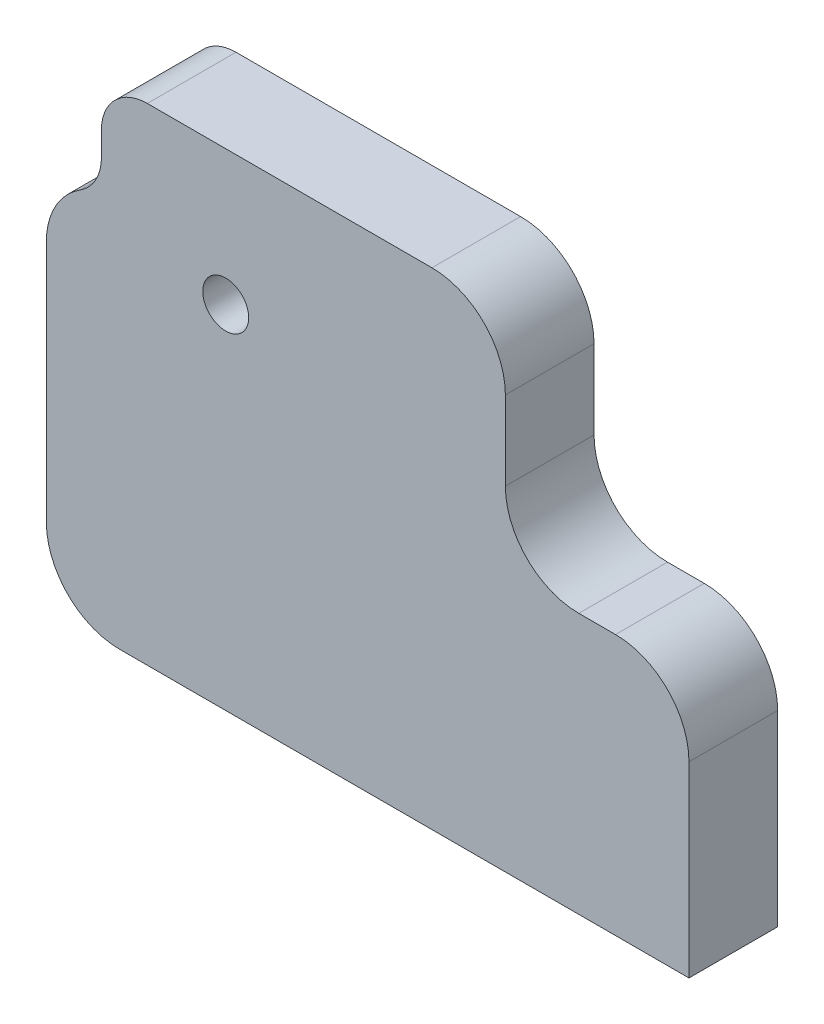
ISO-10303-21;
HEADER;
FILE_DESCRIPTION(('STEP AP214'),'2;1');
FILE_NAME('part.step','',(''),(''),'','','');
FILE_SCHEMA(('AUTOMOTIVE_DESIGN { 1 0 10303 214 1 1 1 1 }'));
ENDSEC;
DATA;
#1=APPLICATION_CONTEXT('core data for automotive mechanical design processes');
#2=APPLICATION_PROTOCOL_DEFINITION('international standard','automotive_design',2000,#1);
#3=PRODUCT_CONTEXT('',#1,'mechanical');
#4=PRODUCT('Part','Part','',(#3));
#5=PRODUCT_RELATED_PRODUCT_CATEGORY('part','',(#4));
#6=PRODUCT_DEFINITION_FORMATION('','',#4);
#7=PRODUCT_DEFINITION_CONTEXT('part definition',#1,'design');
#8=PRODUCT_DEFINITION('design','',#6,#7);
#9=PRODUCT_DEFINITION_SHAPE('','',#8);
#10=(LENGTH_UNIT() NAMED_UNIT(*) SI_UNIT(.MILLI.,.METRE.));
#11=(NAMED_UNIT(*) PLANE_ANGLE_UNIT() SI_UNIT($,.RADIAN.));
#12=(NAMED_UNIT(*) SI_UNIT($,.STERADIAN.) SOLID_ANGLE_UNIT());
#13=UNCERTAINTY_MEASURE_WITH_UNIT(LENGTH_MEASURE(1.E-05),#10,'distance_accuracy_value','');
#14=(GEOMETRIC_REPRESENTATION_CONTEXT(3) GLOBAL_UNCERTAINTY_ASSIGNED_CONTEXT((#13)) GLOBAL_UNIT_ASSIGNED_CONTEXT((#10,
#11,#12)) REPRESENTATION_CONTEXT('',''));
#15=CARTESIAN_POINT('',(0.,0.,0.));
#16=DIRECTION('',(0.,0.,1.));
#17=DIRECTION('',(1.,0.,0.));
#18=AXIS2_PLACEMENT_3D('',#15,#16,#17);
#19=CARTESIAN_POINT('',(19.,5.,2.415));
#20=DIRECTION('',(0.,-1.,0.));
#21=DIRECTION('',(0.,0.,-1.));
#22=AXIS2_PLACEMENT_3D('',#19,#20,#21);
#23=CONICAL_SURFACE('',#22,1.25,1.02974425867665);
#24=CARTESIAN_POINT('',(19.,5.75107577378445,2.415));
#25=VERTEX_POINT('',#24);
#26=VERTEX_LOOP('',#25);
#27=FACE_BOUND('',#26,.T.);
#28=CARTESIAN_POINT('',(19.,5.,2.415));
#29=DIRECTION('',(0.,-1.,0.));
#30=DIRECTION('',(0.,0.,-1.));
#31=AXIS2_PLACEMENT_3D('',#28,#29,#30);
#32=CIRCLE('',#31,1.25);
#33=CARTESIAN_POINT('',(19.,5.,1.165));
#34=VERTEX_POINT('',#33);
#35=EDGE_CURVE('E186',#34,#34,#32,.T.);
#36=ORIENTED_EDGE('',*,*,#35,.T.);
#37=EDGE_LOOP('',(#36));
#38=FACE_BOUND('',#37,.T.);
#39=ADVANCED_FACE('F49',(#27,#38),#23,.F.);
#40=CARTESIAN_POINT('',(19.,0.,2.415));
#41=DIRECTION('',(0.,-1.,0.));
#42=DIRECTION('',(0.,0.,-1.));
#43=AXIS2_PLACEMENT_3D('',#40,#41,#42);
#44=CYLINDRICAL_SURFACE('',#43,1.24999999999999);
#45=ORIENTED_EDGE('',*,*,#35,.F.);
#46=EDGE_LOOP('',(#45));
#47=FACE_BOUND('',#46,.T.);
#48=CARTESIAN_POINT('',(19.,-4.5,2.415));
#49=DIRECTION('',(0.,-1.,0.));
#50=DIRECTION('',(1.,0.,0.));
#51=AXIS2_PLACEMENT_3D('',#48,#49,#50);
#52=CIRCLE('',#51,1.24999999999999);
#53=CARTESIAN_POINT('',(20.25,-4.5,2.415));
#54=VERTEX_POINT('',#53);
#55=EDGE_CURVE('E646',#54,#54,#52,.T.);
#56=ORIENTED_EDGE('',*,*,#55,.T.);
#57=EDGE_LOOP('',(#56));
#58=FACE_BOUND('',#57,.T.);
#59=ADVANCED_FACE('F353',(#47,#58),#44,.F.);
#60=CARTESIAN_POINT('',(0.,-4.5,0.));
#61=DIRECTION('',(0.,1.,0.));
#62=DIRECTION('',(-1.,0.,0.));
#63=AXIS2_PLACEMENT_3D('',#60,#61,#62);
#64=PLANE('',#63);
#65=DIRECTION('',(-1.,0.,0.));
#66=VECTOR('',#65,1.);
#67=CARTESIAN_POINT('',(0.,-4.5,4.83));
#68=LINE('',#67,#66);
#69=CARTESIAN_POINT('',(35.,-4.5,4.83));
#70=VERTEX_POINT('',#69);
#71=CARTESIAN_POINT('',(4.,-4.5,4.83));
#72=VERTEX_POINT('',#71);
#73=EDGE_CURVE('E183',#70,#72,#68,.T.);
#74=ORIENTED_EDGE('',*,*,#73,.T.);
#75=DIRECTION('',(0.,0.,-1.));
#76=VECTOR('',#75,1.);
#77=CARTESIAN_POINT('',(4.,-4.5,0.));
#78=LINE('',#77,#76);
#79=CARTESIAN_POINT('',(4.,-4.5,0.));
#80=VERTEX_POINT('',#79);
#81=EDGE_CURVE('E164',#72,#80,#78,.T.);
#82=ORIENTED_EDGE('',*,*,#81,.T.);
#83=DIRECTION('',(1.,0.,0.));
#84=VECTOR('',#83,1.);
#85=CARTESIAN_POINT('',(0.,-4.5,0.));
#86=LINE('',#85,#84);
#87=CARTESIAN_POINT('',(35.,-4.5,0.));
#88=VERTEX_POINT('',#87);
#89=EDGE_CURVE('E155',#80,#88,#86,.T.);
#90=ORIENTED_EDGE('',*,*,#89,.T.);
#91=DIRECTION('',(0.,0.,1.));
#92=VECTOR('',#91,1.);
#93=CARTESIAN_POINT('',(35.,-4.5,0.));
#94=LINE('',#93,#92);
#95=EDGE_CURVE('E161',#88,#70,#94,.T.);
#96=ORIENTED_EDGE('',*,*,#95,.T.);
#97=EDGE_LOOP('',(#74,#82,#90,#96));
#98=FACE_BOUND('',#97,.T.);
#99=CARTESIAN_POINT('',(31.,-4.5,2.415));
#100=DIRECTION('',(0.,-1.,0.));
#101=DIRECTION('',(1.,0.,0.));
#102=AXIS2_PLACEMENT_3D('',#99,#100,#101);
#103=CIRCLE('',#102,1.25);
#104=CARTESIAN_POINT('',(32.25,-4.5,2.415));
#105=VERTEX_POINT('',#104);
#106=EDGE_CURVE('E166',#105,#105,#103,.T.);
#107=ORIENTED_EDGE('',*,*,#106,.F.);
#108=EDGE_LOOP('',(#107));
#109=FACE_BOUND('',#108,.T.);
#110=ORIENTED_EDGE('',*,*,#55,.F.);
#111=EDGE_LOOP('',(#110));
#112=FACE_BOUND('',#111,.T.);
#113=ADVANCED_FACE('F158',(#98,#109,#112),#64,.F.);
#114=CARTESIAN_POINT('',(0.499999999999999,18.2,4.83));
#115=DIRECTION('',(0.,0.,1.));
#116=DIRECTION('',(1.,0.,0.));
#117=AXIS2_PLACEMENT_3D('',#114,#115,#116);
#118=CYLINDRICAL_SURFACE('',#117,2.5);
#119=CARTESIAN_POINT('',(0.499999999999999,18.2,0.));
#120=DIRECTION('',(0.,0.,1.));
#121=DIRECTION('',(1.,0.,0.));
#122=AXIS2_PLACEMENT_3D('',#119,#120,#121);
#123=CIRCLE('',#122,2.5);
#124=CARTESIAN_POINT('',(1.84615384615385,16.0933747788263,0.));
#125=VERTEX_POINT('',#124);
#126=CARTESIAN_POINT('',(3.,18.2,0.));
#127=VERTEX_POINT('',#126);
#128=EDGE_CURVE('E258',#125,#127,#123,.T.);
#129=ORIENTED_EDGE('',*,*,#128,.F.);
#130=DIRECTION('',(0.,0.,1.));
#131=VECTOR('',#130,1.);
#132=CARTESIAN_POINT('',(1.84615384615385,16.0933747788263,4.83));
#133=LINE('',#132,#131);
#134=CARTESIAN_POINT('',(1.84615384615385,16.0933747788263,4.83));
#135=VERTEX_POINT('',#134);
#136=EDGE_CURVE('E308',#125,#135,#133,.T.);
#137=ORIENTED_EDGE('',*,*,#136,.T.);
#138=CARTESIAN_POINT('',(0.499999999999999,18.2,4.83));
#139=DIRECTION('',(0.,0.,1.));
#140=DIRECTION('',(1.,0.,0.));
#141=AXIS2_PLACEMENT_3D('',#138,#139,#140);
#142=CIRCLE('',#141,2.5);
#143=CARTESIAN_POINT('',(3.,18.2,4.83));
#144=VERTEX_POINT('',#143);
#145=EDGE_CURVE('E261',#144,#135,#142,.F.);
#146=ORIENTED_EDGE('',*,*,#145,.F.);
#147=DIRECTION('',(0.,0.,-1.));
#148=VECTOR('',#147,1.);
#149=CARTESIAN_POINT('',(3.,18.2,4.83));
#150=LINE('',#149,#148);
#151=EDGE_CURVE('E228',#127,#144,#150,.F.);
#152=ORIENTED_EDGE('',*,*,#151,.F.);
#153=EDGE_LOOP('',(#129,#137,#146,#152));
#154=FACE_BOUND('',#153,.T.);
#155=ADVANCED_FACE('F396',(#154),#118,.F.);
#156=CARTESIAN_POINT('',(3.,0.,4.83));
#157=DIRECTION('',(-1.,0.,0.));
#158=DIRECTION('',(0.,0.,1.));
#159=AXIS2_PLACEMENT_3D('',#156,#157,#158);
#160=PLANE('',#159);
#161=DIRECTION('',(0.,1.,0.));
#162=VECTOR('',#161,1.);
#163=CARTESIAN_POINT('',(3.,0.,4.83));
#164=LINE('',#163,#162);
#165=CARTESIAN_POINT('',(3.,19.5,4.83));
#166=VERTEX_POINT('',#165);
#167=EDGE_CURVE('E206',#144,#166,#164,.T.);
#168=ORIENTED_EDGE('',*,*,#167,.T.);
#169=DIRECTION('',(0.,0.,-1.));
#170=VECTOR('',#169,1.);
#171=CARTESIAN_POINT('',(3.,19.5,4.83));
#172=LINE('',#171,#170);
#173=CARTESIAN_POINT('',(3.,19.5,0.));
#174=VERTEX_POINT('',#173);
#175=EDGE_CURVE('E245',#166,#174,#172,.T.);
#176=ORIENTED_EDGE('',*,*,#175,.T.);
#177=DIRECTION('',(0.,1.,0.));
#178=VECTOR('',#177,1.);
#179=CARTESIAN_POINT('',(3.,0.,0.));
#180=LINE('',#179,#178);
#181=EDGE_CURVE('E205',#127,#174,#180,.T.);
#182=ORIENTED_EDGE('',*,*,#181,.F.);
#183=ORIENTED_EDGE('',*,*,#151,.T.);
#184=EDGE_LOOP('',(#168,#176,#182,#183));
#185=FACE_BOUND('',#184,.T.);
#186=ADVANCED_FACE('F393',(#185),#160,.T.);
#187=CARTESIAN_POINT('',(5.5,19.5,4.83));
#188=DIRECTION('',(0.,0.,-1.));
#189=DIRECTION('',(-1.,0.,0.));
#190=AXIS2_PLACEMENT_3D('',#187,#188,#189);
#191=CYLINDRICAL_SURFACE('',#190,2.5);
#192=CARTESIAN_POINT('',(5.5,19.5,4.83));
#193=DIRECTION('',(0.,0.,1.));
#194=DIRECTION('',(1.,0.,0.));
#195=AXIS2_PLACEMENT_3D('',#192,#193,#194);
#196=CIRCLE('',#195,2.5);
#197=CARTESIAN_POINT('',(5.5,22.,4.83));
#198=VERTEX_POINT('',#197);
#199=EDGE_CURVE('E255',#198,#166,#196,.T.);
#200=ORIENTED_EDGE('',*,*,#199,.F.);
#201=DIRECTION('',(0.,0.,-1.));
#202=VECTOR('',#201,1.);
#203=CARTESIAN_POINT('',(5.5,22.,4.83));
#204=LINE('',#203,#202);
#205=CARTESIAN_POINT('',(5.5,22.,0.));
#206=VERTEX_POINT('',#205);
#207=EDGE_CURVE('E252',#206,#198,#204,.F.);
#208=ORIENTED_EDGE('',*,*,#207,.F.);
#209=CARTESIAN_POINT('',(5.5,19.5,0.));
#210=DIRECTION('',(0.,0.,1.));
#211=DIRECTION('',(1.,0.,0.));
#212=AXIS2_PLACEMENT_3D('',#209,#210,#211);
#213=CIRCLE('',#212,2.5);
#214=EDGE_CURVE('E249',#174,#206,#213,.F.);
#215=ORIENTED_EDGE('',*,*,#214,.F.);
#216=ORIENTED_EDGE('',*,*,#175,.F.);
#217=EDGE_LOOP('',(#200,#208,#215,#216));
#218=FACE_BOUND('',#217,.T.);
#219=ADVANCED_FACE('F383',(#218),#191,.T.);
#220=CARTESIAN_POINT('',(0.,22.,4.83));
#221=DIRECTION('',(0.,1.,0.));
#222=DIRECTION('',(-1.,0.,0.));
#223=AXIS2_PLACEMENT_3D('',#220,#221,#222);
#224=PLANE('',#223);
#225=DIRECTION('',(1.,0.,0.));
#226=VECTOR('',#225,1.);
#227=CARTESIAN_POINT('',(0.,22.,4.83));
#228=LINE('',#227,#226);
#229=CARTESIAN_POINT('',(21.,22.,4.83));
#230=VERTEX_POINT('',#229);
#231=EDGE_CURVE('E224',#198,#230,#228,.T.);
#232=ORIENTED_EDGE('',*,*,#231,.T.);
#233=DIRECTION('',(0.,0.,-1.));
#234=VECTOR('',#233,1.);
#235=CARTESIAN_POINT('',(21.,22.,4.83));
#236=LINE('',#235,#234);
#237=CARTESIAN_POINT('',(21.,22.,0.));
#238=VERTEX_POINT('',#237);
#239=EDGE_CURVE('E300',#230,#238,#236,.T.);
#240=ORIENTED_EDGE('',*,*,#239,.T.);
#241=DIRECTION('',(1.,0.,0.));
#242=VECTOR('',#241,1.);
#243=CARTESIAN_POINT('',(0.,22.,0.));
#244=LINE('',#243,#242);
#245=EDGE_CURVE('E211',#206,#238,#244,.T.);
#246=ORIENTED_EDGE('',*,*,#245,.F.);
#247=ORIENTED_EDGE('',*,*,#207,.T.);
#248=EDGE_LOOP('',(#232,#240,#246,#247));
#249=FACE_BOUND('',#248,.T.);
#250=ADVANCED_FACE('F379',(#249),#224,.T.);
#251=CARTESIAN_POINT('',(21.,18.,4.83));
#252=DIRECTION('',(0.,0.,-1.));
#253=DIRECTION('',(-1.,0.,0.));
#254=AXIS2_PLACEMENT_3D('',#251,#252,#253);
#255=CYLINDRICAL_SURFACE('',#254,4.);
#256=CARTESIAN_POINT('',(21.,18.,4.83));
#257=DIRECTION('',(0.,0.,1.));
#258=DIRECTION('',(1.,0.,0.));
#259=AXIS2_PLACEMENT_3D('',#256,#257,#258);
#260=CIRCLE('',#259,4.);
#261=CARTESIAN_POINT('',(25.,18.,4.83));
#262=VERTEX_POINT('',#261);
#263=EDGE_CURVE('E287',#262,#230,#260,.T.);
#264=ORIENTED_EDGE('',*,*,#263,.F.);
#265=DIRECTION('',(0.,0.,-1.));
#266=VECTOR('',#265,1.);
#267=CARTESIAN_POINT('',(25.,18.,4.83));
#268=LINE('',#267,#266);
#269=CARTESIAN_POINT('',(25.,18.,0.));
#270=VERTEX_POINT('',#269);
#271=EDGE_CURVE('E293',#270,#262,#268,.F.);
#272=ORIENTED_EDGE('',*,*,#271,.F.);
#273=CARTESIAN_POINT('',(21.,18.,0.));
#274=DIRECTION('',(0.,0.,1.));
#275=DIRECTION('',(1.,0.,0.));
#276=AXIS2_PLACEMENT_3D('',#273,#274,#275);
#277=CIRCLE('',#276,4.);
#278=EDGE_CURVE('E275',#238,#270,#277,.F.);
#279=ORIENTED_EDGE('',*,*,#278,.F.);
#280=ORIENTED_EDGE('',*,*,#239,.F.);
#281=EDGE_LOOP('',(#264,#272,#279,#280));
#282=FACE_BOUND('',#281,.T.);
#283=ADVANCED_FACE('F382',(#282),#255,.T.);
#284=CARTESIAN_POINT('',(25.,0.,4.83));
#285=DIRECTION('',(1.,0.,0.));
#286=DIRECTION('',(0.,1.,0.));
#287=AXIS2_PLACEMENT_3D('',#284,#285,#286);
#288=PLANE('',#287);
#289=DIRECTION('',(0.,-1.,0.));
#290=VECTOR('',#289,1.);
#291=CARTESIAN_POINT('',(25.,0.,4.83));
#292=LINE('',#291,#290);
#293=CARTESIAN_POINT('',(25.,13.7,4.83));
#294=VERTEX_POINT('',#293);
#295=EDGE_CURVE('E220',#262,#294,#292,.T.);
#296=ORIENTED_EDGE('',*,*,#295,.T.);
#297=DIRECTION('',(0.,0.,-1.));
#298=VECTOR('',#297,1.);
#299=CARTESIAN_POINT('',(25.,13.7,0.));
#300=LINE('',#299,#298);
#301=CARTESIAN_POINT('',(25.,13.7,0.));
#302=VERTEX_POINT('',#301);
#303=EDGE_CURVE('E296',#294,#302,#300,.T.);
#304=ORIENTED_EDGE('',*,*,#303,.T.);
#305=DIRECTION('',(0.,-1.,0.));
#306=VECTOR('',#305,1.);
#307=CARTESIAN_POINT('',(25.,0.,0.));
#308=LINE('',#307,#306);
#309=EDGE_CURVE('E236',#270,#302,#308,.T.);
#310=ORIENTED_EDGE('',*,*,#309,.F.);
#311=ORIENTED_EDGE('',*,*,#271,.T.);
#312=EDGE_LOOP('',(#296,#304,#310,#311));
#313=FACE_BOUND('',#312,.T.);
#314=ADVANCED_FACE('F331',(#313),#288,.T.);
#315=CARTESIAN_POINT('',(29.,13.7,4.83));
#316=DIRECTION('',(0.,0.,1.));
#317=DIRECTION('',(1.,0.,0.));
#318=AXIS2_PLACEMENT_3D('',#315,#316,#317);
#319=CYLINDRICAL_SURFACE('',#318,4.);
#320=CARTESIAN_POINT('',(29.,13.7,4.83));
#321=DIRECTION('',(0.,0.,1.));
#322=DIRECTION('',(1.,0.,0.));
#323=AXIS2_PLACEMENT_3D('',#320,#321,#322);
#324=CIRCLE('',#323,4.);
#325=CARTESIAN_POINT('',(29.,9.7,4.83));
#326=VERTEX_POINT('',#325);
#327=EDGE_CURVE('E314',#326,#294,#324,.F.);
#328=ORIENTED_EDGE('',*,*,#327,.F.);
#329=DIRECTION('',(0.,0.,-1.));
#330=VECTOR('',#329,1.);
#331=CARTESIAN_POINT('',(29.,9.7,4.83));
#332=LINE('',#331,#330);
#333=CARTESIAN_POINT('',(29.,9.7,0.));
#334=VERTEX_POINT('',#333);
#335=EDGE_CURVE('E265',#334,#326,#332,.F.);
#336=ORIENTED_EDGE('',*,*,#335,.F.);
#337=CARTESIAN_POINT('',(29.,13.7,0.));
#338=DIRECTION('',(0.,0.,1.));
#339=DIRECTION('',(1.,0.,0.));
#340=AXIS2_PLACEMENT_3D('',#337,#338,#339);
#341=CIRCLE('',#340,4.);
#342=EDGE_CURVE('E311',#302,#334,#341,.T.);
#343=ORIENTED_EDGE('',*,*,#342,.F.);
#344=ORIENTED_EDGE('',*,*,#303,.F.);
#345=EDGE_LOOP('',(#328,#336,#343,#344));
#346=FACE_BOUND('',#345,.T.);
#347=ADVANCED_FACE('F334',(#346),#319,.F.);
#348=CARTESIAN_POINT('',(0.,9.7,4.83));
#349=DIRECTION('',(0.,1.,0.));
#350=DIRECTION('',(0.,0.,1.));
#351=AXIS2_PLACEMENT_3D('',#348,#349,#350);
#352=PLANE('',#351);
#353=DIRECTION('',(1.,0.,0.));
#354=VECTOR('',#353,1.);
#355=CARTESIAN_POINT('',(0.,9.7,4.83));
#356=LINE('',#355,#354);
#357=CARTESIAN_POINT('',(31.,9.7,4.83));
#358=VERTEX_POINT('',#357);
#359=EDGE_CURVE('E216',#326,#358,#356,.T.);
#360=ORIENTED_EDGE('',*,*,#359,.T.);
#361=DIRECTION('',(0.,0.,-1.));
#362=VECTOR('',#361,1.);
#363=CARTESIAN_POINT('',(31.,9.7,4.83));
#364=LINE('',#363,#362);
#365=CARTESIAN_POINT('',(31.,9.7,0.));
#366=VERTEX_POINT('',#365);
#367=EDGE_CURVE('E268',#358,#366,#364,.T.);
#368=ORIENTED_EDGE('',*,*,#367,.T.);
#369=DIRECTION('',(1.,0.,0.));
#370=VECTOR('',#369,1.);
#371=CARTESIAN_POINT('',(0.,9.7,0.));
#372=LINE('',#371,#370);
#373=EDGE_CURVE('E176',#334,#366,#372,.T.);
#374=ORIENTED_EDGE('',*,*,#373,.F.);
#375=ORIENTED_EDGE('',*,*,#335,.T.);
#376=EDGE_LOOP('',(#360,#368,#374,#375));
#377=FACE_BOUND('',#376,.T.);
#378=ADVANCED_FACE('F337',(#377),#352,.T.);
#379=CARTESIAN_POINT('',(31.,5.7,4.83));
#380=DIRECTION('',(0.,0.,-1.));
#381=DIRECTION('',(-1.,0.,0.));
#382=AXIS2_PLACEMENT_3D('',#379,#380,#381);
#383=CYLINDRICAL_SURFACE('',#382,4.);
#384=CARTESIAN_POINT('',(31.,5.7,4.83));
#385=DIRECTION('',(0.,0.,1.));
#386=DIRECTION('',(1.,0.,0.));
#387=AXIS2_PLACEMENT_3D('',#384,#385,#386);
#388=CIRCLE('',#387,4.);
#389=CARTESIAN_POINT('',(35.,5.7,4.83));
#390=VERTEX_POINT('',#389);
#391=EDGE_CURVE('E290',#390,#358,#388,.T.);
#392=ORIENTED_EDGE('',*,*,#391,.F.);
#393=DIRECTION('',(0.,0.,-1.));
#394=VECTOR('',#393,1.);
#395=CARTESIAN_POINT('',(35.,5.7,4.83));
#396=LINE('',#395,#394);
#397=CARTESIAN_POINT('',(35.,5.7,0.));
#398=VERTEX_POINT('',#397);
#399=EDGE_CURVE('E280',#398,#390,#396,.F.);
#400=ORIENTED_EDGE('',*,*,#399,.F.);
#401=CARTESIAN_POINT('',(31.,5.7,0.));
#402=DIRECTION('',(0.,0.,1.));
#403=DIRECTION('',(1.,0.,0.));
#404=AXIS2_PLACEMENT_3D('',#401,#402,#403);
#405=CIRCLE('',#404,4.);
#406=EDGE_CURVE('E172',#366,#398,#405,.F.);
#407=ORIENTED_EDGE('',*,*,#406,.F.);
#408=ORIENTED_EDGE('',*,*,#367,.F.);
#409=EDGE_LOOP('',(#392,#400,#407,#408));
#410=FACE_BOUND('',#409,.T.);
#411=ADVANCED_FACE('F341',(#410),#383,.T.);
#412=CARTESIAN_POINT('',(9.77,14.65,4.83));
#413=DIRECTION('',(0.,0.,1.));
#414=DIRECTION('',(1.,0.,0.));
#415=AXIS2_PLACEMENT_3D('',#412,#413,#414);
#416=CYLINDRICAL_SURFACE('',#415,1.24999999999999);
#417=CARTESIAN_POINT('',(9.77,14.65,0.));
#418=DIRECTION('',(0.,0.,1.));
#419=DIRECTION('',(1.,0.,0.));
#420=AXIS2_PLACEMENT_3D('',#417,#418,#419);
#421=CIRCLE('',#420,1.25);
#422=CARTESIAN_POINT('',(11.02,14.65,0.));
#423=VERTEX_POINT('',#422);
#424=EDGE_CURVE('E201',#423,#423,#421,.T.);
#425=ORIENTED_EDGE('',*,*,#424,.F.);
#426=EDGE_LOOP('',(#425));
#427=FACE_BOUND('',#426,.T.);
#428=CARTESIAN_POINT('',(9.77,14.65,4.83));
#429=DIRECTION('',(0.,0.,1.));
#430=DIRECTION('',(1.,0.,0.));
#431=AXIS2_PLACEMENT_3D('',#428,#429,#430);
#432=CIRCLE('',#431,1.24999999999999);
#433=CARTESIAN_POINT('',(11.02,14.65,4.83));
#434=VERTEX_POINT('',#433);
#435=EDGE_CURVE('E197',#434,#434,#432,.T.);
#436=ORIENTED_EDGE('',*,*,#435,.T.);
#437=EDGE_LOOP('',(#436));
#438=FACE_BOUND('',#437,.T.);
#439=ADVANCED_FACE('F367',(#427,#438),#416,.F.);
#440=CARTESIAN_POINT('',(4.,12.7227744249483,4.83));
#441=DIRECTION('',(0.,0.,1.));
#442=DIRECTION('',(1.,0.,0.));
#443=AXIS2_PLACEMENT_3D('',#440,#441,#442);
#444=CYLINDRICAL_SURFACE('',#443,4.);
#445=CARTESIAN_POINT('',(4.,12.7227744249483,4.83));
#446=DIRECTION('',(0.,0.,1.));
#447=DIRECTION('',(1.,0.,0.));
#448=AXIS2_PLACEMENT_3D('',#445,#446,#447);
#449=CIRCLE('',#448,4.);
#450=CARTESIAN_POINT('',(0.,12.7227744249483,4.83));
#451=VERTEX_POINT('',#450);
#452=EDGE_CURVE('E283',#135,#451,#449,.T.);
#453=ORIENTED_EDGE('',*,*,#452,.F.);
#454=ORIENTED_EDGE('',*,*,#136,.F.);
#455=CARTESIAN_POINT('',(4.,12.7227744249483,0.));
#456=DIRECTION('',(0.,0.,1.));
#457=DIRECTION('',(1.,0.,0.));
#458=AXIS2_PLACEMENT_3D('',#455,#456,#457);
#459=CIRCLE('',#458,4.);
#460=CARTESIAN_POINT('',(0.,12.7227744249483,0.));
#461=VERTEX_POINT('',#460);
#462=EDGE_CURVE('E272',#461,#125,#459,.F.);
#463=ORIENTED_EDGE('',*,*,#462,.F.);
#464=DIRECTION('',(0.,0.,-1.));
#465=VECTOR('',#464,1.);
#466=CARTESIAN_POINT('',(0.,12.7227744249483,0.));
#467=LINE('',#466,#465);
#468=EDGE_CURVE('E304',#451,#461,#467,.T.);
#469=ORIENTED_EDGE('',*,*,#468,.F.);
#470=EDGE_LOOP('',(#453,#454,#463,#469));
#471=FACE_BOUND('',#470,.T.);
#472=ADVANCED_FACE('F370',(#471),#444,.T.);
#473=CARTESIAN_POINT('',(0.,0.,4.83));
#474=DIRECTION('',(-1.,0.,0.));
#475=DIRECTION('',(0.,0.,1.));
#476=AXIS2_PLACEMENT_3D('',#473,#474,#475);
#477=PLANE('',#476);
#478=DIRECTION('',(0.,1.,0.));
#479=VECTOR('',#478,1.);
#480=CARTESIAN_POINT('',(0.,0.,0.));
#481=LINE('',#480,#479);
#482=CARTESIAN_POINT('',(0.,-0.499999999999999,0.));
#483=VERTEX_POINT('',#482);
#484=EDGE_CURVE('E177',#483,#461,#481,.T.);
#485=ORIENTED_EDGE('',*,*,#484,.F.);
#486=DIRECTION('',(0.,0.,-1.));
#487=VECTOR('',#486,1.);
#488=CARTESIAN_POINT('',(0.,-0.499999999999999,4.83));
#489=LINE('',#488,#487);
#490=CARTESIAN_POINT('',(0.,-0.499999999999999,4.83));
#491=VERTEX_POINT('',#490);
#492=EDGE_CURVE('E58',#483,#491,#489,.F.);
#493=ORIENTED_EDGE('',*,*,#492,.T.);
#494=DIRECTION('',(0.,1.,0.));
#495=VECTOR('',#494,1.);
#496=CARTESIAN_POINT('',(0.,0.,4.83));
#497=LINE('',#496,#495);
#498=EDGE_CURVE('E210',#491,#451,#497,.T.);
#499=ORIENTED_EDGE('',*,*,#498,.T.);
#500=ORIENTED_EDGE('',*,*,#468,.T.);
#501=EDGE_LOOP('',(#485,#493,#499,#500));
#502=FACE_BOUND('',#501,.T.);
#503=ADVANCED_FACE('F374',(#502),#477,.T.);
#504=CARTESIAN_POINT('',(0.,0.,4.83));
#505=DIRECTION('',(0.,0.,1.));
#506=DIRECTION('',(1.,0.,0.));
#507=AXIS2_PLACEMENT_3D('',#504,#505,#506);
#508=PLANE('',#507);
#509=ORIENTED_EDGE('',*,*,#435,.F.);
#510=EDGE_LOOP('',(#509));
#511=FACE_BOUND('',#510,.T.);
#512=ORIENTED_EDGE('',*,*,#498,.F.);
#513=CARTESIAN_POINT('',(4.,-0.499999999999999,4.83));
#514=DIRECTION('',(0.,0.,1.));
#515=DIRECTION('',(1.,0.,0.));
#516=AXIS2_PLACEMENT_3D('',#513,#514,#515);
#517=CIRCLE('',#516,4.);
#518=EDGE_CURVE('E11',#491,#72,#517,.T.);
#519=ORIENTED_EDGE('',*,*,#518,.T.);
#520=ORIENTED_EDGE('',*,*,#73,.F.);
#521=DIRECTION('',(0.,-1.,0.));
#522=VECTOR('',#521,1.);
#523=CARTESIAN_POINT('',(35.,0.,4.83));
#524=LINE('',#523,#522);
#525=EDGE_CURVE('E181',#390,#70,#524,.T.);
#526=ORIENTED_EDGE('',*,*,#525,.F.);
#527=ORIENTED_EDGE('',*,*,#391,.T.);
#528=ORIENTED_EDGE('',*,*,#359,.F.);
#529=ORIENTED_EDGE('',*,*,#327,.T.);
#530=ORIENTED_EDGE('',*,*,#295,.F.);
#531=ORIENTED_EDGE('',*,*,#263,.T.);
#532=ORIENTED_EDGE('',*,*,#231,.F.);
#533=ORIENTED_EDGE('',*,*,#199,.T.);
#534=ORIENTED_EDGE('',*,*,#167,.F.);
#535=ORIENTED_EDGE('',*,*,#145,.T.);
#536=ORIENTED_EDGE('',*,*,#452,.T.);
#537=EDGE_LOOP('',(#512,#519,#520,#526,#527,#528,#529,#530,#531,#532,#533,#534,#535,#536));
#538=FACE_BOUND('',#537,.T.);
#539=ADVANCED_FACE('F325',(#511,#538),#508,.T.);
#540=CARTESIAN_POINT('',(35.,0.,4.83));
#541=DIRECTION('',(1.,0.,0.));
#542=DIRECTION('',(0.,0.,-1.));
#543=AXIS2_PLACEMENT_3D('',#540,#541,#542);
#544=PLANE('',#543);
#545=DIRECTION('',(0.,-1.,0.));
#546=VECTOR('',#545,1.);
#547=CARTESIAN_POINT('',(35.,0.,0.));
#548=LINE('',#547,#546);
#549=EDGE_CURVE('E169',#398,#88,#548,.T.);
#550=ORIENTED_EDGE('',*,*,#549,.F.);
#551=ORIENTED_EDGE('',*,*,#399,.T.);
#552=ORIENTED_EDGE('',*,*,#525,.T.);
#553=ORIENTED_EDGE('',*,*,#95,.F.);
#554=EDGE_LOOP('',(#550,#551,#552,#553));
#555=FACE_BOUND('',#554,.T.);
#556=ADVANCED_FACE('F179',(#555),#544,.T.);
#557=CARTESIAN_POINT('',(0.,0.,0.));
#558=DIRECTION('',(0.,0.,1.));
#559=DIRECTION('',(1.,0.,0.));
#560=AXIS2_PLACEMENT_3D('',#557,#558,#559);
#561=PLANE('',#560);
#562=ORIENTED_EDGE('',*,*,#424,.T.);
#563=EDGE_LOOP('',(#562));
#564=FACE_BOUND('',#563,.T.);
#565=ORIENTED_EDGE('',*,*,#89,.F.);
#566=CARTESIAN_POINT('',(4.,-0.499999999999999,0.));
#567=DIRECTION('',(0.,0.,1.));
#568=DIRECTION('',(1.,0.,0.));
#569=AXIS2_PLACEMENT_3D('',#566,#567,#568);
#570=CIRCLE('',#569,4.);
#571=EDGE_CURVE('E72',#80,#483,#570,.F.);
#572=ORIENTED_EDGE('',*,*,#571,.T.);
#573=ORIENTED_EDGE('',*,*,#484,.T.);
#574=ORIENTED_EDGE('',*,*,#462,.T.);
#575=ORIENTED_EDGE('',*,*,#128,.T.);
#576=ORIENTED_EDGE('',*,*,#181,.T.);
#577=ORIENTED_EDGE('',*,*,#214,.T.);
#578=ORIENTED_EDGE('',*,*,#245,.T.);
#579=ORIENTED_EDGE('',*,*,#278,.T.);
#580=ORIENTED_EDGE('',*,*,#309,.T.);
#581=ORIENTED_EDGE('',*,*,#342,.T.);
#582=ORIENTED_EDGE('',*,*,#373,.T.);
#583=ORIENTED_EDGE('',*,*,#406,.T.);
#584=ORIENTED_EDGE('',*,*,#549,.T.);
#585=EDGE_LOOP('',(#565,#572,#573,#574,#575,#576,#577,#578,#579,#580,#581,#582,#583,#584));
#586=FACE_BOUND('',#585,.T.);
#587=ADVANCED_FACE('F170',(#564,#586),#561,.F.);
#588=CARTESIAN_POINT('',(31.,5.,2.415));
#589=DIRECTION('',(0.,-1.,0.));
#590=DIRECTION('',(0.,0.,-1.));
#591=AXIS2_PLACEMENT_3D('',#588,#589,#590);
#592=CONICAL_SURFACE('',#591,1.25,1.02974425867666);
#593=CARTESIAN_POINT('',(31.,5.75107577378445,2.415));
#594=VERTEX_POINT('',#593);
#595=VERTEX_LOOP('',#594);
#596=FACE_BOUND('',#595,.T.);
#597=CARTESIAN_POINT('',(31.,5.,2.415));
#598=DIRECTION('',(0.,-1.,0.));
#599=DIRECTION('',(0.,0.,-1.));
#600=AXIS2_PLACEMENT_3D('',#597,#598,#599);
#601=CIRCLE('',#600,1.25);
#602=CARTESIAN_POINT('',(31.,5.,1.165));
#603=VERTEX_POINT('',#602);
#604=EDGE_CURVE('E193',#603,#603,#601,.T.);
#605=ORIENTED_EDGE('',*,*,#604,.T.);
#606=EDGE_LOOP('',(#605));
#607=FACE_BOUND('',#606,.T.);
#608=ADVANCED_FACE('F349',(#596,#607),#592,.F.);
#609=CARTESIAN_POINT('',(31.,0.,2.415));
#610=DIRECTION('',(0.,-1.,0.));
#611=DIRECTION('',(0.,0.,-1.));
#612=AXIS2_PLACEMENT_3D('',#609,#610,#611);
#613=CYLINDRICAL_SURFACE('',#612,1.24999999999999);
#614=ORIENTED_EDGE('',*,*,#604,.F.);
#615=EDGE_LOOP('',(#614));
#616=FACE_BOUND('',#615,.T.);
#617=ORIENTED_EDGE('',*,*,#106,.T.);
#618=EDGE_LOOP('',(#617));
#619=FACE_BOUND('',#618,.T.);
#620=ADVANCED_FACE('F345',(#616,#619),#613,.F.);
#621=CARTESIAN_POINT('',(4.,-0.499999999999999,0.));
#622=DIRECTION('',(0.,0.,1.));
#623=DIRECTION('',(1.,0.,0.));
#624=AXIS2_PLACEMENT_3D('',#621,#622,#623);
#625=CYLINDRICAL_SURFACE('',#624,4.);
#626=ORIENTED_EDGE('',*,*,#518,.F.);
#627=ORIENTED_EDGE('',*,*,#492,.F.);
#628=ORIENTED_EDGE('',*,*,#571,.F.);
#629=ORIENTED_EDGE('',*,*,#81,.F.);
#630=EDGE_LOOP('',(#626,#627,#628,#629));
#631=FACE_BOUND('',#630,.T.);
#632=ADVANCED_FACE('F51',(#631),#625,.T.);
#633=CLOSED_SHELL('',(#39,#59,#113,#155,#186,#219,#250,#283,#314,#347,#378,#411,#439,#472,#503,
#539,#556,#587,#608,#620,#632));
#634=MANIFOLD_SOLID_BREP('B2',#633);
#635=ADVANCED_BREP_SHAPE_REPRESENTATION('',(#18,#634),#14);
#636=SHAPE_DEFINITION_REPRESENTATION(#9,#635);
ENDSEC;
END-ISO-10303-21;
